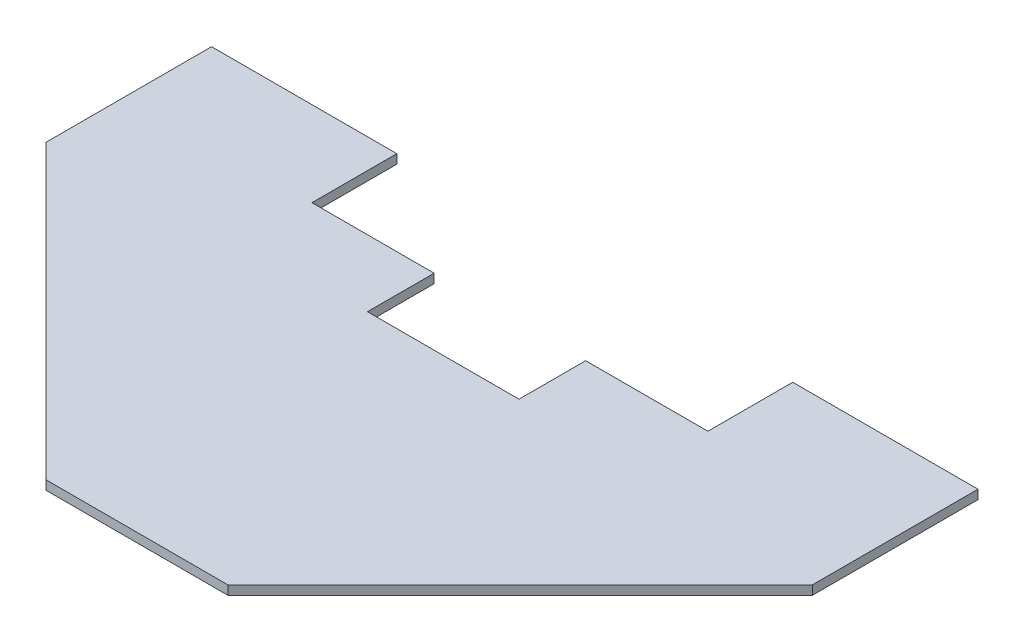
ISO-10303-21;
HEADER;
FILE_DESCRIPTION(('STEP AP214'),'2;1');
FILE_NAME('part.step','',(''),(''),'','','');
FILE_SCHEMA(('AUTOMOTIVE_DESIGN { 1 0 10303 214 1 1 1 1 }'));
ENDSEC;
DATA;
#1=APPLICATION_CONTEXT('core data for automotive mechanical design processes');
#2=APPLICATION_PROTOCOL_DEFINITION('international standard','automotive_design',2000,#1);
#3=PRODUCT_CONTEXT('',#1,'mechanical');
#4=PRODUCT('Part','Part','',(#3));
#5=PRODUCT_RELATED_PRODUCT_CATEGORY('part','',(#4));
#6=PRODUCT_DEFINITION_FORMATION('','',#4);
#7=PRODUCT_DEFINITION_CONTEXT('part definition',#1,'design');
#8=PRODUCT_DEFINITION('design','',#6,#7);
#9=PRODUCT_DEFINITION_SHAPE('','',#8);
#10=(LENGTH_UNIT() NAMED_UNIT(*) SI_UNIT(.MILLI.,.METRE.));
#11=(NAMED_UNIT(*) PLANE_ANGLE_UNIT() SI_UNIT($,.RADIAN.));
#12=(NAMED_UNIT(*) SI_UNIT($,.STERADIAN.) SOLID_ANGLE_UNIT());
#13=UNCERTAINTY_MEASURE_WITH_UNIT(LENGTH_MEASURE(1.E-05),#10,'distance_accuracy_value','');
#14=(GEOMETRIC_REPRESENTATION_CONTEXT(3) GLOBAL_UNCERTAINTY_ASSIGNED_CONTEXT((#13)) GLOBAL_UNIT_ASSIGNED_CONTEXT((#10,
#11,#12)) REPRESENTATION_CONTEXT('',''));
#15=CARTESIAN_POINT('',(0.,0.,0.));
#16=DIRECTION('',(0.,0.,1.));
#17=DIRECTION('',(1.,0.,0.));
#18=AXIS2_PLACEMENT_3D('',#15,#16,#17);
#19=CARTESIAN_POINT('',(252.882034355965,-6.,-100.));
#20=DIRECTION('',(0.,0.,-1.));
#21=DIRECTION('',(-1.,0.,0.));
#22=AXIS2_PLACEMENT_3D('',#19,#20,#21);
#23=PLANE('',#22);
#24=DIRECTION('',(-1.,0.,0.));
#25=VECTOR('',#24,1.);
#26=CARTESIAN_POINT('',(252.882034355965,0.,-100.));
#27=LINE('',#26,#25);
#28=CARTESIAN_POINT('',(252.882034355965,0.,-100.));
#29=VERTEX_POINT('',#28);
#30=CARTESIAN_POINT('',(130.626438317931,0.,-99.9999999999996));
#31=VERTEX_POINT('',#30);
#32=EDGE_CURVE('E138',#29,#31,#27,.T.);
#33=ORIENTED_EDGE('',*,*,#32,.F.);
#34=DIRECTION('',(0.,1.,0.));
#35=VECTOR('',#34,1.);
#36=CARTESIAN_POINT('',(252.882034355965,-6.,-100.));
#37=LINE('',#36,#35);
#38=CARTESIAN_POINT('',(252.882034355965,-6.,-100.));
#39=VERTEX_POINT('',#38);
#40=EDGE_CURVE('E11',#39,#29,#37,.T.);
#41=ORIENTED_EDGE('',*,*,#40,.F.);
#42=DIRECTION('',(-1.,0.,0.));
#43=VECTOR('',#42,1.);
#44=CARTESIAN_POINT('',(252.882034355965,-6.,-100.));
#45=LINE('',#44,#43);
#46=CARTESIAN_POINT('',(130.626438317931,-6.,-99.9999999999996));
#47=VERTEX_POINT('',#46);
#48=EDGE_CURVE('E159',#39,#47,#45,.T.);
#49=ORIENTED_EDGE('',*,*,#48,.T.);
#50=DIRECTION('',(0.,1.,0.));
#51=VECTOR('',#50,1.);
#52=CARTESIAN_POINT('',(130.626438317931,-6.,-99.9999999999996));
#53=LINE('',#52,#51);
#54=EDGE_CURVE('E41',#47,#31,#53,.T.);
#55=ORIENTED_EDGE('',*,*,#54,.T.);
#56=EDGE_LOOP('',(#33,#41,#49,#55));
#57=FACE_BOUND('',#56,.T.);
#58=ADVANCED_FACE('F38',(#57),#23,.T.);
#59=CARTESIAN_POINT('',(252.882034355965,-6.,9.25000000000023));
#60=DIRECTION('',(1.,0.,0.));
#61=DIRECTION('',(0.,0.,-1.));
#62=AXIS2_PLACEMENT_3D('',#59,#60,#61);
#63=PLANE('',#62);
#64=DIRECTION('',(0.,0.,-1.));
#65=VECTOR('',#64,1.);
#66=CARTESIAN_POINT('',(252.882034355965,0.,9.25000000000023));
#67=LINE('',#66,#65);
#68=CARTESIAN_POINT('',(252.882034355965,0.,9.25000000000023));
#69=VERTEX_POINT('',#68);
#70=EDGE_CURVE('E157',#69,#29,#67,.T.);
#71=ORIENTED_EDGE('',*,*,#70,.F.);
#72=DIRECTION('',(0.,1.,0.));
#73=VECTOR('',#72,1.);
#74=CARTESIAN_POINT('',(252.882034355965,-6.,9.25000000000023));
#75=LINE('',#74,#73);
#76=CARTESIAN_POINT('',(252.882034355965,-6.,9.25000000000023));
#77=VERTEX_POINT('',#76);
#78=EDGE_CURVE('E47',#77,#69,#75,.T.);
#79=ORIENTED_EDGE('',*,*,#78,.F.);
#80=DIRECTION('',(0.,0.,-1.));
#81=VECTOR('',#80,1.);
#82=CARTESIAN_POINT('',(252.882034355965,-6.,9.25000000000023));
#83=LINE('',#82,#81);
#84=EDGE_CURVE('E124',#77,#39,#83,.T.);
#85=ORIENTED_EDGE('',*,*,#84,.T.);
#86=ORIENTED_EDGE('',*,*,#40,.T.);
#87=EDGE_LOOP('',(#71,#79,#85,#86));
#88=FACE_BOUND('',#87,.T.);
#89=ADVANCED_FACE('F169',(#88),#63,.T.);
#90=CARTESIAN_POINT('',(59.9999999999998,-6.,202.132034355964));
#91=DIRECTION('',(0.707106781186546,0.,0.707106781186549));
#92=DIRECTION('',(0.707106781186549,0.,-0.707106781186546));
#93=AXIS2_PLACEMENT_3D('',#90,#91,#92);
#94=PLANE('',#93);
#95=DIRECTION('',(0.707106781186549,0.,-0.707106781186546));
#96=VECTOR('',#95,1.);
#97=CARTESIAN_POINT('',(59.9999999999998,0.,202.132034355964));
#98=LINE('',#97,#96);
#99=CARTESIAN_POINT('',(59.9999999999998,0.,202.132034355964));
#100=VERTEX_POINT('',#99);
#101=EDGE_CURVE('E110',#100,#69,#98,.T.);
#102=ORIENTED_EDGE('',*,*,#101,.F.);
#103=DIRECTION('',(0.,1.,0.));
#104=VECTOR('',#103,1.);
#105=CARTESIAN_POINT('',(59.9999999999998,-6.,202.132034355964));
#106=LINE('',#105,#104);
#107=CARTESIAN_POINT('',(59.9999999999998,-6.,202.132034355964));
#108=VERTEX_POINT('',#107);
#109=EDGE_CURVE('E105',#108,#100,#106,.T.);
#110=ORIENTED_EDGE('',*,*,#109,.F.);
#111=DIRECTION('',(0.707106781186549,0.,-0.707106781186546));
#112=VECTOR('',#111,1.);
#113=CARTESIAN_POINT('',(59.9999999999998,-6.,202.132034355964));
#114=LINE('',#113,#112);
#115=EDGE_CURVE('E108',#108,#77,#114,.T.);
#116=ORIENTED_EDGE('',*,*,#115,.T.);
#117=ORIENTED_EDGE('',*,*,#78,.T.);
#118=EDGE_LOOP('',(#102,#110,#116,#117));
#119=FACE_BOUND('',#118,.T.);
#120=ADVANCED_FACE('F107',(#119),#94,.T.);
#121=CARTESIAN_POINT('',(0.,-6.,202.132034355964));
#122=DIRECTION('',(0.,0.,1.));
#123=DIRECTION('',(1.,0.,0.));
#124=AXIS2_PLACEMENT_3D('',#121,#122,#123);
#125=PLANE('',#124);
#126=DIRECTION('',(1.,0.,0.));
#127=VECTOR('',#126,1.);
#128=CARTESIAN_POINT('',(0.,0.,202.132034355964));
#129=LINE('',#128,#127);
#130=CARTESIAN_POINT('',(-59.9999999999998,0.,202.132034355965));
#131=VERTEX_POINT('',#130);
#132=EDGE_CURVE('E154',#131,#100,#129,.T.);
#133=ORIENTED_EDGE('',*,*,#132,.F.);
#134=DIRECTION('',(0.,1.,0.));
#135=VECTOR('',#134,1.);
#136=CARTESIAN_POINT('',(-59.9999999999998,-6.,202.132034355965));
#137=LINE('',#136,#135);
#138=CARTESIAN_POINT('',(-59.9999999999998,-6.,202.132034355965));
#139=VERTEX_POINT('',#138);
#140=EDGE_CURVE('E128',#139,#131,#137,.T.);
#141=ORIENTED_EDGE('',*,*,#140,.F.);
#142=DIRECTION('',(1.,0.,0.));
#143=VECTOR('',#142,1.);
#144=CARTESIAN_POINT('',(0.,-6.,202.132034355964));
#145=LINE('',#144,#143);
#146=EDGE_CURVE('E122',#139,#108,#145,.T.);
#147=ORIENTED_EDGE('',*,*,#146,.T.);
#148=ORIENTED_EDGE('',*,*,#109,.T.);
#149=EDGE_LOOP('',(#133,#141,#147,#148));
#150=FACE_BOUND('',#149,.T.);
#151=ADVANCED_FACE('F126',(#150),#125,.T.);
#152=CARTESIAN_POINT('',(0.,-6.,0.));
#153=DIRECTION('',(0.,0.,-1.));
#154=DIRECTION('',(-1.,0.,0.));
#155=AXIS2_PLACEMENT_3D('',#152,#153,#154);
#156=PLANE('',#155);
#157=DIRECTION('',(-1.,0.,0.));
#158=VECTOR('',#157,1.);
#159=CARTESIAN_POINT('',(0.,0.,0.));
#160=LINE('',#159,#158);
#161=CARTESIAN_POINT('',(49.9999999999998,0.,0.));
#162=VERTEX_POINT('',#161);
#163=CARTESIAN_POINT('',(-49.9999999999998,0.,0.));
#164=VERTEX_POINT('',#163);
#165=EDGE_CURVE('E151',#162,#164,#160,.T.);
#166=ORIENTED_EDGE('',*,*,#165,.F.);
#167=DIRECTION('',(0.,1.,0.));
#168=VECTOR('',#167,1.);
#169=CARTESIAN_POINT('',(49.9999999999998,-6.,0.));
#170=LINE('',#169,#168);
#171=CARTESIAN_POINT('',(49.9999999999998,-6.,0.));
#172=VERTEX_POINT('',#171);
#173=EDGE_CURVE('E115',#172,#162,#170,.T.);
#174=ORIENTED_EDGE('',*,*,#173,.F.);
#175=DIRECTION('',(-1.,0.,0.));
#176=VECTOR('',#175,1.);
#177=CARTESIAN_POINT('',(0.,-6.,0.));
#178=LINE('',#177,#176);
#179=CARTESIAN_POINT('',(-49.9999999999998,-6.,0.));
#180=VERTEX_POINT('',#179);
#181=EDGE_CURVE('E130',#172,#180,#178,.T.);
#182=ORIENTED_EDGE('',*,*,#181,.T.);
#183=DIRECTION('',(0.,1.,0.));
#184=VECTOR('',#183,1.);
#185=CARTESIAN_POINT('',(-49.9999999999998,-6.,0.));
#186=LINE('',#185,#184);
#187=EDGE_CURVE('E270',#180,#164,#186,.T.);
#188=ORIENTED_EDGE('',*,*,#187,.T.);
#189=EDGE_LOOP('',(#166,#174,#182,#188));
#190=FACE_BOUND('',#189,.T.);
#191=ADVANCED_FACE('F182',(#190),#156,.T.);
#192=CARTESIAN_POINT('',(49.9999999999998,-6.,-43.9999999999992));
#193=DIRECTION('',(-1.,0.,0.));
#194=DIRECTION('',(0.,0.,1.));
#195=AXIS2_PLACEMENT_3D('',#192,#193,#194);
#196=PLANE('',#195);
#197=DIRECTION('',(0.,0.,1.));
#198=VECTOR('',#197,1.);
#199=CARTESIAN_POINT('',(49.9999999999998,0.,-43.9999999999992));
#200=LINE('',#199,#198);
#201=CARTESIAN_POINT('',(49.9999999999998,0.,-43.9999999999992));
#202=VERTEX_POINT('',#201);
#203=EDGE_CURVE('E148',#202,#162,#200,.T.);
#204=ORIENTED_EDGE('',*,*,#203,.F.);
#205=DIRECTION('',(0.,1.,0.));
#206=VECTOR('',#205,1.);
#207=CARTESIAN_POINT('',(49.9999999999998,-6.,-43.9999999999992));
#208=LINE('',#207,#206);
#209=CARTESIAN_POINT('',(49.9999999999998,-6.,-43.9999999999992));
#210=VERTEX_POINT('',#209);
#211=EDGE_CURVE('E163',#210,#202,#208,.T.);
#212=ORIENTED_EDGE('',*,*,#211,.F.);
#213=DIRECTION('',(0.,0.,1.));
#214=VECTOR('',#213,1.);
#215=CARTESIAN_POINT('',(49.9999999999998,-6.,-43.9999999999992));
#216=LINE('',#215,#214);
#217=EDGE_CURVE('E133',#210,#172,#216,.T.);
#218=ORIENTED_EDGE('',*,*,#217,.T.);
#219=ORIENTED_EDGE('',*,*,#173,.T.);
#220=EDGE_LOOP('',(#204,#212,#218,#219));
#221=FACE_BOUND('',#220,.T.);
#222=ADVANCED_FACE('F185',(#221),#196,.T.);
#223=CARTESIAN_POINT('',(130.626438317931,-6.,-43.9999999999992));
#224=DIRECTION('',(0.,0.,-1.));
#225=DIRECTION('',(-1.,0.,0.));
#226=AXIS2_PLACEMENT_3D('',#223,#224,#225);
#227=PLANE('',#226);
#228=DIRECTION('',(-1.,0.,0.));
#229=VECTOR('',#228,1.);
#230=CARTESIAN_POINT('',(130.626438317931,0.,-43.9999999999992));
#231=LINE('',#230,#229);
#232=CARTESIAN_POINT('',(130.626438317931,0.,-43.9999999999992));
#233=VERTEX_POINT('',#232);
#234=EDGE_CURVE('E145',#233,#202,#231,.T.);
#235=ORIENTED_EDGE('',*,*,#234,.F.);
#236=DIRECTION('',(0.,1.,0.));
#237=VECTOR('',#236,1.);
#238=CARTESIAN_POINT('',(130.626438317931,-6.,-43.9999999999992));
#239=LINE('',#238,#237);
#240=CARTESIAN_POINT('',(130.626438317931,-6.,-43.9999999999992));
#241=VERTEX_POINT('',#240);
#242=EDGE_CURVE('E164',#241,#233,#239,.T.);
#243=ORIENTED_EDGE('',*,*,#242,.F.);
#244=DIRECTION('',(-1.,0.,0.));
#245=VECTOR('',#244,1.);
#246=CARTESIAN_POINT('',(130.626438317931,-6.,-43.9999999999992));
#247=LINE('',#246,#245);
#248=EDGE_CURVE('E284',#241,#210,#247,.T.);
#249=ORIENTED_EDGE('',*,*,#248,.T.);
#250=ORIENTED_EDGE('',*,*,#211,.T.);
#251=EDGE_LOOP('',(#235,#243,#249,#250));
#252=FACE_BOUND('',#251,.T.);
#253=ADVANCED_FACE('F189',(#252),#227,.T.);
#254=CARTESIAN_POINT('',(130.626438317931,-6.,-99.9999999999996));
#255=DIRECTION('',(-1.,0.,0.));
#256=DIRECTION('',(0.,0.,1.));
#257=AXIS2_PLACEMENT_3D('',#254,#255,#256);
#258=PLANE('',#257);
#259=DIRECTION('',(0.,0.,1.));
#260=VECTOR('',#259,1.);
#261=CARTESIAN_POINT('',(130.626438317931,0.,-99.9999999999996));
#262=LINE('',#261,#260);
#263=EDGE_CURVE('E141',#31,#233,#262,.T.);
#264=ORIENTED_EDGE('',*,*,#263,.F.);
#265=ORIENTED_EDGE('',*,*,#54,.F.);
#266=DIRECTION('',(0.,0.,1.));
#267=VECTOR('',#266,1.);
#268=CARTESIAN_POINT('',(130.626438317931,-6.,-99.9999999999996));
#269=LINE('',#268,#267);
#270=EDGE_CURVE('E282',#47,#241,#269,.T.);
#271=ORIENTED_EDGE('',*,*,#270,.T.);
#272=ORIENTED_EDGE('',*,*,#242,.T.);
#273=EDGE_LOOP('',(#264,#265,#271,#272));
#274=FACE_BOUND('',#273,.T.);
#275=ADVANCED_FACE('F166',(#274),#258,.T.);
#276=CARTESIAN_POINT('',(0.,-6.,0.));
#277=DIRECTION('',(0.,1.,0.));
#278=DIRECTION('',(0.,0.,1.));
#279=AXIS2_PLACEMENT_3D('',#276,#277,#278);
#280=PLANE('',#279);
#281=ORIENTED_EDGE('',*,*,#48,.F.);
#282=ORIENTED_EDGE('',*,*,#84,.F.);
#283=ORIENTED_EDGE('',*,*,#115,.F.);
#284=ORIENTED_EDGE('',*,*,#146,.F.);
#285=DIRECTION('',(-0.707106781186549,0.,-0.707106781186546));
#286=VECTOR('',#285,1.);
#287=CARTESIAN_POINT('',(-59.9999999999998,-6.,202.132034355965));
#288=LINE('',#287,#286);
#289=CARTESIAN_POINT('',(-252.882034355965,-6.,9.25000000000029));
#290=VERTEX_POINT('',#289);
#291=EDGE_CURVE('E309',#139,#290,#288,.T.);
#292=ORIENTED_EDGE('',*,*,#291,.T.);
#293=DIRECTION('',(0.,0.,-1.));
#294=VECTOR('',#293,1.);
#295=CARTESIAN_POINT('',(-252.882034355965,-6.,9.25000000000029));
#296=LINE('',#295,#294);
#297=CARTESIAN_POINT('',(-252.882034355965,-6.,-100.));
#298=VERTEX_POINT('',#297);
#299=EDGE_CURVE('E258',#290,#298,#296,.T.);
#300=ORIENTED_EDGE('',*,*,#299,.T.);
#301=DIRECTION('',(1.,0.,0.));
#302=VECTOR('',#301,1.);
#303=CARTESIAN_POINT('',(-252.882034355965,-6.,-100.));
#304=LINE('',#303,#302);
#305=CARTESIAN_POINT('',(-130.626438317931,-6.,-99.9999999999995));
#306=VERTEX_POINT('',#305);
#307=EDGE_CURVE('E240',#298,#306,#304,.T.);
#308=ORIENTED_EDGE('',*,*,#307,.T.);
#309=DIRECTION('',(0.,0.,1.));
#310=VECTOR('',#309,1.);
#311=CARTESIAN_POINT('',(-130.626438317931,-6.,-99.9999999999995));
#312=LINE('',#311,#310);
#313=CARTESIAN_POINT('',(-130.626438317931,-6.,-43.9999999999992));
#314=VERTEX_POINT('',#313);
#315=EDGE_CURVE('E311',#306,#314,#312,.T.);
#316=ORIENTED_EDGE('',*,*,#315,.T.);
#317=DIRECTION('',(1.,0.,0.));
#318=VECTOR('',#317,1.);
#319=CARTESIAN_POINT('',(-130.626438317931,-6.,-43.9999999999992));
#320=LINE('',#319,#318);
#321=CARTESIAN_POINT('',(-49.9999999999998,-6.,-43.9999999999992));
#322=VERTEX_POINT('',#321);
#323=EDGE_CURVE('E308',#314,#322,#320,.T.);
#324=ORIENTED_EDGE('',*,*,#323,.T.);
#325=DIRECTION('',(0.,0.,1.));
#326=VECTOR('',#325,1.);
#327=CARTESIAN_POINT('',(-49.9999999999998,-6.,-43.9999999999992));
#328=LINE('',#327,#326);
#329=EDGE_CURVE('E305',#322,#180,#328,.T.);
#330=ORIENTED_EDGE('',*,*,#329,.T.);
#331=ORIENTED_EDGE('',*,*,#181,.F.);
#332=ORIENTED_EDGE('',*,*,#217,.F.);
#333=ORIENTED_EDGE('',*,*,#248,.F.);
#334=ORIENTED_EDGE('',*,*,#270,.F.);
#335=EDGE_LOOP('',(#281,#282,#283,#284,#292,#300,#308,#316,#324,#330,#331,#332,#333,#334));
#336=FACE_BOUND('',#335,.T.);
#337=ADVANCED_FACE('F119',(#336),#280,.F.);
#338=CARTESIAN_POINT('',(0.,0.,0.));
#339=DIRECTION('',(0.,1.,0.));
#340=DIRECTION('',(0.,0.,1.));
#341=AXIS2_PLACEMENT_3D('',#338,#339,#340);
#342=PLANE('',#341);
#343=ORIENTED_EDGE('',*,*,#32,.T.);
#344=ORIENTED_EDGE('',*,*,#263,.T.);
#345=ORIENTED_EDGE('',*,*,#234,.T.);
#346=ORIENTED_EDGE('',*,*,#203,.T.);
#347=ORIENTED_EDGE('',*,*,#165,.T.);
#348=DIRECTION('',(0.,0.,1.));
#349=VECTOR('',#348,1.);
#350=CARTESIAN_POINT('',(-49.9999999999998,0.,-43.9999999999992));
#351=LINE('',#350,#349);
#352=CARTESIAN_POINT('',(-49.9999999999998,0.,-43.9999999999992));
#353=VERTEX_POINT('',#352);
#354=EDGE_CURVE('E263',#353,#164,#351,.T.);
#355=ORIENTED_EDGE('',*,*,#354,.F.);
#356=DIRECTION('',(1.,0.,0.));
#357=VECTOR('',#356,1.);
#358=CARTESIAN_POINT('',(-130.626438317931,0.,-43.9999999999992));
#359=LINE('',#358,#357);
#360=CARTESIAN_POINT('',(-130.626438317931,0.,-43.9999999999992));
#361=VERTEX_POINT('',#360);
#362=EDGE_CURVE('E255',#361,#353,#359,.T.);
#363=ORIENTED_EDGE('',*,*,#362,.F.);
#364=DIRECTION('',(0.,0.,1.));
#365=VECTOR('',#364,1.);
#366=CARTESIAN_POINT('',(-130.626438317931,0.,-99.9999999999995));
#367=LINE('',#366,#365);
#368=CARTESIAN_POINT('',(-130.626438317931,0.,-99.9999999999995));
#369=VERTEX_POINT('',#368);
#370=EDGE_CURVE('E252',#369,#361,#367,.T.);
#371=ORIENTED_EDGE('',*,*,#370,.F.);
#372=DIRECTION('',(1.,0.,0.));
#373=VECTOR('',#372,1.);
#374=CARTESIAN_POINT('',(-252.882034355965,0.,-100.));
#375=LINE('',#374,#373);
#376=CARTESIAN_POINT('',(-252.882034355965,0.,-100.));
#377=VERTEX_POINT('',#376);
#378=EDGE_CURVE('E246',#377,#369,#375,.T.);
#379=ORIENTED_EDGE('',*,*,#378,.F.);
#380=DIRECTION('',(0.,0.,-1.));
#381=VECTOR('',#380,1.);
#382=CARTESIAN_POINT('',(-252.882034355965,0.,9.25000000000029));
#383=LINE('',#382,#381);
#384=CARTESIAN_POINT('',(-252.882034355965,0.,9.25000000000029));
#385=VERTEX_POINT('',#384);
#386=EDGE_CURVE('E230',#385,#377,#383,.T.);
#387=ORIENTED_EDGE('',*,*,#386,.F.);
#388=DIRECTION('',(-0.707106781186549,0.,-0.707106781186546));
#389=VECTOR('',#388,1.);
#390=CARTESIAN_POINT('',(-59.9999999999998,0.,202.132034355965));
#391=LINE('',#390,#389);
#392=EDGE_CURVE('E241',#131,#385,#391,.T.);
#393=ORIENTED_EDGE('',*,*,#392,.F.);
#394=ORIENTED_EDGE('',*,*,#132,.T.);
#395=ORIENTED_EDGE('',*,*,#101,.T.);
#396=ORIENTED_EDGE('',*,*,#70,.T.);
#397=EDGE_LOOP('',(#343,#344,#345,#346,#347,#355,#363,#371,#379,#387,#393,#394,#395,#396));
#398=FACE_BOUND('',#397,.T.);
#399=ADVANCED_FACE('F168',(#398),#342,.T.);
#400=CARTESIAN_POINT('',(-252.882034355965,-6.,-100.));
#401=DIRECTION('',(0.,0.,-1.));
#402=DIRECTION('',(1.,0.,0.));
#403=AXIS2_PLACEMENT_3D('',#400,#401,#402);
#404=PLANE('',#403);
#405=ORIENTED_EDGE('',*,*,#378,.T.);
#406=DIRECTION('',(0.,1.,0.));
#407=VECTOR('',#406,1.);
#408=CARTESIAN_POINT('',(-130.626438317931,-6.,-99.9999999999995));
#409=LINE('',#408,#407);
#410=EDGE_CURVE('E279',#306,#369,#409,.T.);
#411=ORIENTED_EDGE('',*,*,#410,.F.);
#412=ORIENTED_EDGE('',*,*,#307,.F.);
#413=DIRECTION('',(0.,1.,0.));
#414=VECTOR('',#413,1.);
#415=CARTESIAN_POINT('',(-252.882034355965,-6.,-100.));
#416=LINE('',#415,#414);
#417=EDGE_CURVE('E142',#298,#377,#416,.T.);
#418=ORIENTED_EDGE('',*,*,#417,.T.);
#419=EDGE_LOOP('',(#405,#411,#412,#418));
#420=FACE_BOUND('',#419,.T.);
#421=ADVANCED_FACE('F200',(#420),#404,.T.);
#422=CARTESIAN_POINT('',(-252.882034355965,-6.,9.25000000000029));
#423=DIRECTION('',(-1.,0.,0.));
#424=DIRECTION('',(0.,0.,-1.));
#425=AXIS2_PLACEMENT_3D('',#422,#423,#424);
#426=PLANE('',#425);
#427=ORIENTED_EDGE('',*,*,#386,.T.);
#428=ORIENTED_EDGE('',*,*,#417,.F.);
#429=ORIENTED_EDGE('',*,*,#299,.F.);
#430=DIRECTION('',(0.,1.,0.));
#431=VECTOR('',#430,1.);
#432=CARTESIAN_POINT('',(-252.882034355965,-6.,9.25000000000029));
#433=LINE('',#432,#431);
#434=EDGE_CURVE('E236',#290,#385,#433,.T.);
#435=ORIENTED_EDGE('',*,*,#434,.T.);
#436=EDGE_LOOP('',(#427,#428,#429,#435));
#437=FACE_BOUND('',#436,.T.);
#438=ADVANCED_FACE('F204',(#437),#426,.T.);
#439=CARTESIAN_POINT('',(-59.9999999999998,-6.,202.132034355965));
#440=DIRECTION('',(-0.707106781186546,0.,0.707106781186549));
#441=DIRECTION('',(-0.707106781186549,0.,-0.707106781186546));
#442=AXIS2_PLACEMENT_3D('',#439,#440,#441);
#443=PLANE('',#442);
#444=ORIENTED_EDGE('',*,*,#392,.T.);
#445=ORIENTED_EDGE('',*,*,#434,.F.);
#446=ORIENTED_EDGE('',*,*,#291,.F.);
#447=ORIENTED_EDGE('',*,*,#140,.T.);
#448=EDGE_LOOP('',(#444,#445,#446,#447));
#449=FACE_BOUND('',#448,.T.);
#450=ADVANCED_FACE('F217',(#449),#443,.T.);
#451=CARTESIAN_POINT('',(-49.9999999999998,-6.,-43.9999999999992));
#452=DIRECTION('',(1.,0.,0.));
#453=DIRECTION('',(0.,0.,1.));
#454=AXIS2_PLACEMENT_3D('',#451,#452,#453);
#455=PLANE('',#454);
#456=ORIENTED_EDGE('',*,*,#354,.T.);
#457=ORIENTED_EDGE('',*,*,#187,.F.);
#458=ORIENTED_EDGE('',*,*,#329,.F.);
#459=DIRECTION('',(0.,1.,0.));
#460=VECTOR('',#459,1.);
#461=CARTESIAN_POINT('',(-49.9999999999998,-6.,-43.9999999999992));
#462=LINE('',#461,#460);
#463=EDGE_CURVE('E273',#322,#353,#462,.T.);
#464=ORIENTED_EDGE('',*,*,#463,.T.);
#465=EDGE_LOOP('',(#456,#457,#458,#464));
#466=FACE_BOUND('',#465,.T.);
#467=ADVANCED_FACE('F213',(#466),#455,.T.);
#468=CARTESIAN_POINT('',(-130.626438317931,-6.,-43.9999999999992));
#469=DIRECTION('',(0.,0.,-1.));
#470=DIRECTION('',(1.,0.,0.));
#471=AXIS2_PLACEMENT_3D('',#468,#469,#470);
#472=PLANE('',#471);
#473=ORIENTED_EDGE('',*,*,#362,.T.);
#474=ORIENTED_EDGE('',*,*,#463,.F.);
#475=ORIENTED_EDGE('',*,*,#323,.F.);
#476=DIRECTION('',(0.,1.,0.));
#477=VECTOR('',#476,1.);
#478=CARTESIAN_POINT('',(-130.626438317931,-6.,-43.9999999999992));
#479=LINE('',#478,#477);
#480=EDGE_CURVE('E276',#314,#361,#479,.T.);
#481=ORIENTED_EDGE('',*,*,#480,.T.);
#482=EDGE_LOOP('',(#473,#474,#475,#481));
#483=FACE_BOUND('',#482,.T.);
#484=ADVANCED_FACE('F209',(#483),#472,.T.);
#485=CARTESIAN_POINT('',(-130.626438317931,-6.,-99.9999999999995));
#486=DIRECTION('',(1.,0.,0.));
#487=DIRECTION('',(0.,0.,1.));
#488=AXIS2_PLACEMENT_3D('',#485,#486,#487);
#489=PLANE('',#488);
#490=ORIENTED_EDGE('',*,*,#370,.T.);
#491=ORIENTED_EDGE('',*,*,#480,.F.);
#492=ORIENTED_EDGE('',*,*,#315,.F.);
#493=ORIENTED_EDGE('',*,*,#410,.T.);
#494=EDGE_LOOP('',(#490,#491,#492,#493));
#495=FACE_BOUND('',#494,.T.);
#496=ADVANCED_FACE('F206',(#495),#489,.T.);
#497=CLOSED_SHELL('',(#58,#89,#120,#151,#191,#222,#253,#275,#337,#399,#421,#438,#450,#467,#484,#496));
#498=MANIFOLD_SOLID_BREP('B2',#497);
#499=ADVANCED_BREP_SHAPE_REPRESENTATION('',(#18,#498),#14);
#500=SHAPE_DEFINITION_REPRESENTATION(#9,#499);
ENDSEC;
END-ISO-10303-21;
